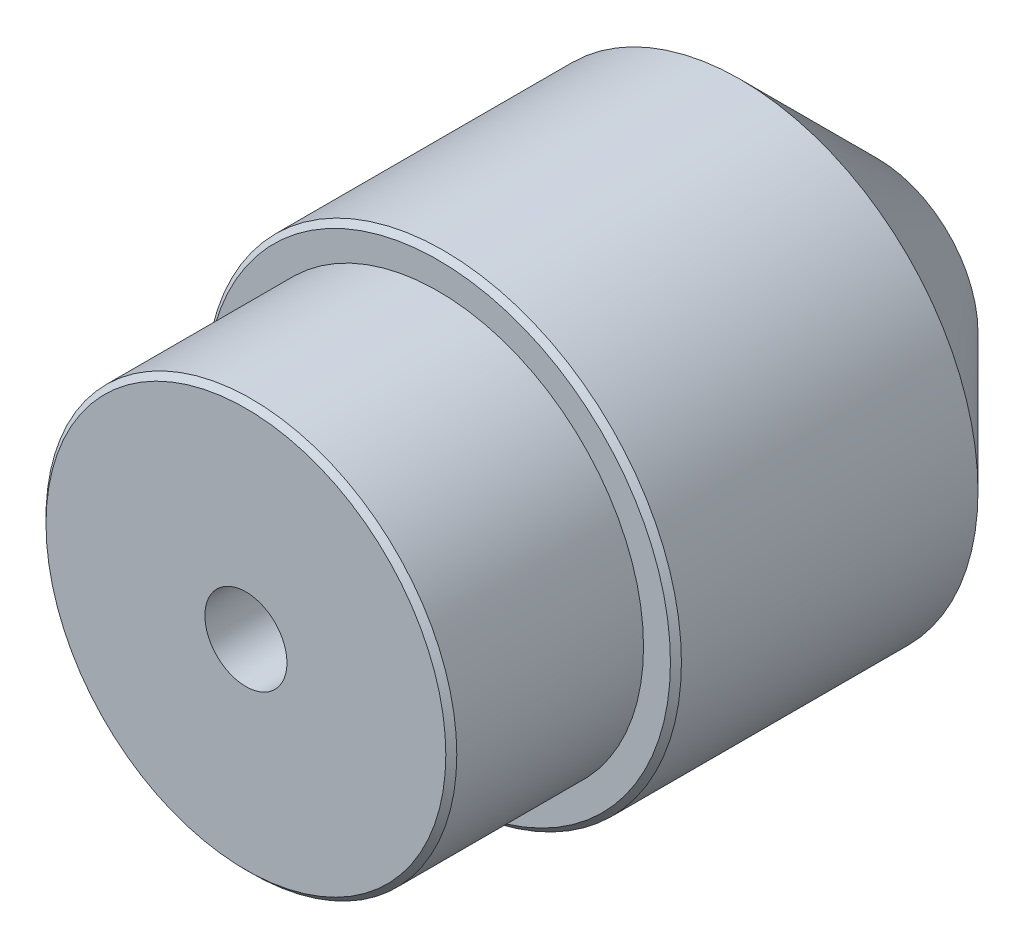
ISO-10303-21;
HEADER;
FILE_DESCRIPTION(('STEP AP214'),'2;1');
FILE_NAME('part.step','',(''),(''),'','','');
FILE_SCHEMA(('AUTOMOTIVE_DESIGN { 1 0 10303 214 1 1 1 1 }'));
ENDSEC;
DATA;
#1=APPLICATION_CONTEXT('core data for automotive mechanical design processes');
#2=APPLICATION_PROTOCOL_DEFINITION('international standard','automotive_design',2000,#1);
#3=PRODUCT_CONTEXT('',#1,'mechanical');
#4=PRODUCT('Part','Part','',(#3));
#5=PRODUCT_RELATED_PRODUCT_CATEGORY('part','',(#4));
#6=PRODUCT_DEFINITION_FORMATION('','',#4);
#7=PRODUCT_DEFINITION_CONTEXT('part definition',#1,'design');
#8=PRODUCT_DEFINITION('design','',#6,#7);
#9=PRODUCT_DEFINITION_SHAPE('','',#8);
#10=(LENGTH_UNIT() NAMED_UNIT(*) SI_UNIT(.MILLI.,.METRE.));
#11=(NAMED_UNIT(*) PLANE_ANGLE_UNIT() SI_UNIT($,.RADIAN.));
#12=(NAMED_UNIT(*) SI_UNIT($,.STERADIAN.) SOLID_ANGLE_UNIT());
#13=UNCERTAINTY_MEASURE_WITH_UNIT(LENGTH_MEASURE(1.E-05),#10,'distance_accuracy_value','');
#14=(GEOMETRIC_REPRESENTATION_CONTEXT(3) GLOBAL_UNCERTAINTY_ASSIGNED_CONTEXT((#13)) GLOBAL_UNIT_ASSIGNED_CONTEXT((#10,
#11,#12)) REPRESENTATION_CONTEXT('',''));
#15=CARTESIAN_POINT('',(0.,0.,0.));
#16=DIRECTION('',(0.,0.,1.));
#17=DIRECTION('',(1.,0.,0.));
#18=AXIS2_PLACEMENT_3D('',#15,#16,#17);
#19=CARTESIAN_POINT('',(0.,0.,20.32));
#20=DIRECTION('',(0.,0.,1.));
#21=DIRECTION('',(1.,0.,0.));
#22=AXIS2_PLACEMENT_3D('',#19,#20,#21);
#23=PLANE('',#22);
#24=CARTESIAN_POINT('',(0.,0.,20.32));
#25=DIRECTION('',(0.,0.,1.));
#26=DIRECTION('',(1.,0.,0.));
#27=AXIS2_PLACEMENT_3D('',#24,#25,#26);
#28=CIRCLE('',#27,10.7442);
#29=CARTESIAN_POINT('',(10.7442,0.,20.32));
#30=VERTEX_POINT('',#29);
#31=EDGE_CURVE('E46',#30,#30,#28,.T.);
#32=ORIENTED_EDGE('',*,*,#31,.T.);
#33=EDGE_LOOP('',(#32));
#34=FACE_BOUND('',#33,.T.);
#35=CARTESIAN_POINT('',(0.,0.,20.32));
#36=DIRECTION('',(0.,0.,1.));
#37=DIRECTION('',(1.,0.,0.));
#38=AXIS2_PLACEMENT_3D('',#35,#36,#37);
#39=CIRCLE('',#38,9.4996);
#40=CARTESIAN_POINT('',(9.4996,0.,20.32));
#41=VERTEX_POINT('',#40);
#42=EDGE_CURVE('E57',#41,#41,#39,.T.);
#43=ORIENTED_EDGE('',*,*,#42,.F.);
#44=EDGE_LOOP('',(#43));
#45=FACE_BOUND('',#44,.T.);
#46=ADVANCED_FACE('F31',(#34,#45),#23,.T.);
#47=CARTESIAN_POINT('',(0.,0.,20.32));
#48=DIRECTION('',(0.,0.,-1.));
#49=DIRECTION('',(-1.,0.,0.));
#50=AXIS2_PLACEMENT_3D('',#47,#48,#49);
#51=CYLINDRICAL_SURFACE('',#50,10.9982);
#52=CARTESIAN_POINT('',(0.,0.,20.066));
#53=DIRECTION('',(0.,0.,1.));
#54=DIRECTION('',(1.,0.,0.));
#55=AXIS2_PLACEMENT_3D('',#52,#53,#54);
#56=CIRCLE('',#55,10.9982);
#57=CARTESIAN_POINT('',(10.9982,0.,20.066));
#58=VERTEX_POINT('',#57);
#59=EDGE_CURVE('E42',#58,#58,#56,.F.);
#60=ORIENTED_EDGE('',*,*,#59,.T.);
#61=EDGE_LOOP('',(#60));
#62=FACE_BOUND('',#61,.T.);
#63=CARTESIAN_POINT('',(0.,0.,6.35000000000001));
#64=DIRECTION('',(0.,0.,1.));
#65=DIRECTION('',(1.,0.,0.));
#66=AXIS2_PLACEMENT_3D('',#63,#64,#65);
#67=CIRCLE('',#66,10.9982);
#68=CARTESIAN_POINT('',(10.9982,0.,6.35000000000001));
#69=VERTEX_POINT('',#68);
#70=EDGE_CURVE('E54',#69,#69,#67,.T.);
#71=ORIENTED_EDGE('',*,*,#70,.T.);
#72=EDGE_LOOP('',(#71));
#73=FACE_BOUND('',#72,.T.);
#74=CARTESIAN_POINT('',(-10.9982,0.,7.62635));
#75=CARTESIAN_POINT('',(-10.9981981522027,0.105805169699775,7.62635419118731));
#76=CARTESIAN_POINT('',(-10.9966573299572,0.211666676377545,7.63522411230453));
#77=CARTESIAN_POINT('',(-10.9906590947304,0.420416744316915,7.67045246854653));
#78=CARTESIAN_POINT('',(-10.9861990603541,0.523302546664586,7.69682662242512));
#79=CARTESIAN_POINT('',(-10.9748622852022,0.723051150412462,7.76624017992813));
#80=CARTESIAN_POINT('',(-10.9679875786801,0.819918941127061,7.80926555873592));
#81=CARTESIAN_POINT('',(-10.9525759242116,1.0050491882992,7.91072263706737));
#82=CARTESIAN_POINT('',(-10.9440391509983,1.0933125478777,7.96915271732388));
#83=CARTESIAN_POINT('',(-10.9261509827298,1.25964245652852,8.10039581415953));
#84=CARTESIAN_POINT('',(-10.9167928453608,1.33760825695068,8.17333560829417));
#85=CARTESIAN_POINT('',(-10.8983678395601,1.48025924536532,8.33125479214989));
#86=CARTESIAN_POINT('',(-10.8893009902165,1.54494356451329,8.41623496891143));
#87=CARTESIAN_POINT('',(-10.8724198005586,1.6596034386086,8.59652025629677));
#88=CARTESIAN_POINT('',(-10.8646141679122,1.70947857462869,8.69189011914977));
#89=CARTESIAN_POINT('',(-10.8512331660203,1.79246196515001,8.88981163247926));
#90=CARTESIAN_POINT('',(-10.8456576348104,1.82557143732857,8.99236276076994));
#91=CARTESIAN_POINT('',(-10.8374354569708,1.87376456677414,9.20066492804943));
#92=CARTESIAN_POINT('',(-10.8347604863597,1.88902266098775,9.3063744695933));
#93=CARTESIAN_POINT('',(-10.8325567036275,1.90162092301735,9.51888454772653));
#94=CARTESIAN_POINT('',(-10.8330276526229,1.89896245131767,9.62568500086322));
#95=CARTESIAN_POINT('',(-10.8370366568575,1.87594495377548,9.8360949488731));
#96=CARTESIAN_POINT('',(-10.8405406429477,1.85578253684005,9.93972669549237));
#97=CARTESIAN_POINT('',(-10.8501675314227,1.79863833012198,10.1421140951366));
#98=CARTESIAN_POINT('',(-10.8562905295773,1.76165592527637,10.2408695697027));
#99=CARTESIAN_POINT('',(-10.8705020116869,1.67172415481341,10.431286037754));
#100=CARTESIAN_POINT('',(-10.8786004276022,1.61869376874274,10.5229079943307));
#101=CARTESIAN_POINT('',(-10.8958434562452,1.49822883443675,10.6960274072288));
#102=CARTESIAN_POINT('',(-10.9049881593818,1.43079304100222,10.7775239873519));
#103=CARTESIAN_POINT('',(-10.9234427448171,1.2823633962788,10.9292167556477));
#104=CARTESIAN_POINT('',(-10.9327532053692,1.20120099766036,10.999248056485));
#105=CARTESIAN_POINT('',(-10.9503778984883,1.02819041146371,11.1247235170541));
#106=CARTESIAN_POINT('',(-10.9586921237378,0.936342145406323,11.1801675696446));
#107=CARTESIAN_POINT('',(-10.9734006631464,0.744407370237959,11.2749122184387));
#108=CARTESIAN_POINT('',(-10.9797931591835,0.644313173087853,11.3141975399402));
#109=CARTESIAN_POINT('',(-10.9899235510794,0.438812227991438,11.3753527971164));
#110=CARTESIAN_POINT('',(-10.9936616854047,0.333405958190309,11.3972242972608));
#111=CARTESIAN_POINT('',(-10.9980299124006,0.121693421344151,11.4227058942165));
#112=CARTESIAN_POINT('',(-10.9986985071316,0.0154151509765399,11.4265422257411));
#113=CARTESIAN_POINT('',(-10.9969580240364,-0.196265152216859,11.4164487533041));
#114=CARTESIAN_POINT('',(-10.9945490735758,-0.301667221122969,11.4025196845722));
#115=CARTESIAN_POINT('',(-10.9869480445593,-0.50789918000874,11.3574789660847));
#116=CARTESIAN_POINT('',(-10.981774224469,-0.608754411344912,11.3264800009839));
#117=CARTESIAN_POINT('',(-10.9692212006634,-0.803836403059839,11.2483000604198));
#118=CARTESIAN_POINT('',(-10.9618418657218,-0.898062768614464,11.2011181220587));
#119=CARTESIAN_POINT('',(-10.9456006544914,-1.07819027625845,11.0913982115847));
#120=CARTESIAN_POINT('',(-10.9367254668053,-1.16400462837157,11.0287197651377));
#121=CARTESIAN_POINT('',(-10.9185154356284,-1.32397810118442,10.8899784113338));
#122=CARTESIAN_POINT('',(-10.9091805561973,-1.3981363086614,10.8139144562523));
#123=CARTESIAN_POINT('',(-10.8909778456659,-1.53353684175208,10.6495438905259));
#124=CARTESIAN_POINT('',(-10.8821163854313,-1.59462587659879,10.5611101879177));
#125=CARTESIAN_POINT('',(-10.8659852864205,-1.7010814285635,10.375103121543));
#126=CARTESIAN_POINT('',(-10.8587155945956,-1.74644846967563,10.2775300625174));
#127=CARTESIAN_POINT('',(-10.8466395475728,-1.81994621607004,10.076431771547));
#128=CARTESIAN_POINT('',(-10.8418225409144,-1.84815155676469,9.97293448628562));
#129=CARTESIAN_POINT('',(-10.835171176123,-1.88675893490306,9.76258058260205));
#130=CARTESIAN_POINT('',(-10.8333365378178,-1.89716264468804,9.65572428069706));
#131=CARTESIAN_POINT('',(-10.832870305882,-1.89982221280537,9.44321755037282));
#132=CARTESIAN_POINT('',(-10.8341961030065,-1.89231948552592,9.33757015976555));
#133=CARTESIAN_POINT('',(-10.8398076728573,-1.85990296358853,9.12906547522124));
#134=CARTESIAN_POINT('',(-10.8440934339185,-1.83498923754644,9.02620817029028));
#135=CARTESIAN_POINT('',(-10.8551253546543,-1.76855304089431,8.82630681792631));
#136=CARTESIAN_POINT('',(-10.8618682148489,-1.72705283599704,8.72925517695578));
#137=CARTESIAN_POINT('',(-10.8770575206373,-1.62864691817877,8.54345293648553));
#138=CARTESIAN_POINT('',(-10.8855040607473,-1.57174035048881,8.45470279793377));
#139=CARTESIAN_POINT('',(-10.9032833331209,-1.4432815796682,8.28680595562742));
#140=CARTESIAN_POINT('',(-10.9126259718329,-1.37155227727316,8.20779577993173));
#141=CARTESIAN_POINT('',(-10.9310671230827,-1.21585664466577,8.06285135278722));
#142=CARTESIAN_POINT('',(-10.9401655788911,-1.13188749950346,7.9969201175233));
#143=CARTESIAN_POINT('',(-10.957172232591,-0.95334871378384,7.87955220916349));
#144=CARTESIAN_POINT('',(-10.9650710374569,-0.85870461468337,7.82822742056621));
#145=CARTESIAN_POINT('',(-10.9786970083391,-0.662037635621355,7.74228550052501));
#146=CARTESIAN_POINT('',(-10.9844263024651,-0.560022104038684,7.70765198718156));
#147=CARTESIAN_POINT('',(-10.9918398510686,-0.381362912160016,7.66346074938477));
#148=CARTESIAN_POINT('',(-10.9942119628291,-0.305790667160204,7.64956691011833));
#149=CARTESIAN_POINT('',(-10.9973926924862,-0.153488816913143,7.63101010412905));
#150=CARTESIAN_POINT('',(-10.9982013405347,-0.07675923401428,7.62634695938934));
#151=CARTESIAN_POINT('',(-10.9982,0.,7.62635));
#152=B_SPLINE_CURVE_WITH_KNOTS('',3,(#74,#75,#76,#77,#78,#79,#80,#81,#82,#83,#84,#85,#86,#87,
#88,#89,#90,#91,#92,#93,#94,#95,#96,#97,#98,#99,#100,#101,#102,#103,#104,#105,#106,#107,#108,
#109,#110,#111,#112,#113,#114,#115,#116,#117,#118,#119,#120,#121,#122,#123,#124,#125,#126,#127,
#128,#129,#130,#131,#132,#133,#134,#135,#136,#137,#138,#139,#140,#141,#142,#143,#144,#145,#146,
#147,#148,#149,#150,#151),.UNSPECIFIED.,.T.,.F.,(4,2,2,2,2,2,2,2,2,2,2,2,2,2,2,2,2,2,2,2,2,2,2,
2,2,2,2,2,2,2,2,2,2,2,2,2,2,2,4),(0.,0.31713489522746,0.634554962760638,0.951708256916438,
1.26882822674582,1.58885140688077,1.90889551554415,2.23106267822915,2.55320643880246,
2.87217532118704,3.19111998312225,3.50652785763044,3.82194726670695,4.13898646109478,
4.45605307135564,4.77734081510208,5.09863091859963,5.42022404057008,5.74178826713134,
6.05930780462554,6.37681420184572,6.692249321927,7.00770321386824,7.32612883958857,
7.64457940054628,7.96658197809409,8.28857382267205,8.60915514026151,8.92970633977867,
9.24596033656176,9.56221308701077,9.87804271762409,10.1938898745481,10.513754946496,
10.8336936982264,11.1560209682863,11.4780312379429,11.7081097982125,11.9381839213005),.UNSPECIFIED.);
#153=CARTESIAN_POINT('',(-10.9982,0.,7.62635));
#154=VERTEX_POINT('',#153);
#155=EDGE_CURVE('E65',#154,#154,#152,.T.);
#156=ORIENTED_EDGE('',*,*,#155,.T.);
#157=EDGE_LOOP('',(#156));
#158=FACE_BOUND('',#157,.T.);
#159=CARTESIAN_POINT('',(0.,-10.9982,11.42365));
#160=CARTESIAN_POINT('',(0.105805169699774,-10.9981981522027,11.4236458088127));
#161=CARTESIAN_POINT('',(0.211666676377545,-10.9966573299572,11.4147758876955));
#162=CARTESIAN_POINT('',(0.420416744316915,-10.9906590947304,11.3795475314535));
#163=CARTESIAN_POINT('',(0.523302546664586,-10.9861990603541,11.3531733775749));
#164=CARTESIAN_POINT('',(0.723051150412462,-10.9748622852022,11.2837598200719));
#165=CARTESIAN_POINT('',(0.819918941127061,-10.9679875786801,11.2407344412641));
#166=CARTESIAN_POINT('',(1.0050491882992,-10.9525759242116,11.1392773629326));
#167=CARTESIAN_POINT('',(1.0933125478777,-10.9440391509983,11.0808472826761));
#168=CARTESIAN_POINT('',(1.25964245652852,-10.9261509827298,10.9496041858405));
#169=CARTESIAN_POINT('',(1.33760825695068,-10.9167928453608,10.8766643917058));
#170=CARTESIAN_POINT('',(1.48025924536532,-10.8983678395601,10.7187452078501));
#171=CARTESIAN_POINT('',(1.54494356451329,-10.8893009902165,10.6337650310886));
#172=CARTESIAN_POINT('',(1.65960343860861,-10.8724198005586,10.4534797437032));
#173=CARTESIAN_POINT('',(1.70947857462869,-10.8646141679122,10.3581098808502));
#174=CARTESIAN_POINT('',(1.79246196515001,-10.8512331660203,10.1601883675207));
#175=CARTESIAN_POINT('',(1.82557143732857,-10.8456576348104,10.0576372392301));
#176=CARTESIAN_POINT('',(1.87376456677414,-10.8374354569708,9.84933507195057));
#177=CARTESIAN_POINT('',(1.88902266098775,-10.8347604863597,9.7436255304067));
#178=CARTESIAN_POINT('',(1.90162092301735,-10.8325567036275,9.53111545227347));
#179=CARTESIAN_POINT('',(1.89896245131767,-10.8330276526229,9.42431499913678));
#180=CARTESIAN_POINT('',(1.87594495377548,-10.8370366568575,9.2139050511269));
#181=CARTESIAN_POINT('',(1.85578253684005,-10.8405406429477,9.11027330450763));
#182=CARTESIAN_POINT('',(1.79863833012198,-10.8501675314227,8.90788590486339));
#183=CARTESIAN_POINT('',(1.76165592527637,-10.8562905295773,8.80913043029733));
#184=CARTESIAN_POINT('',(1.67172415481341,-10.8705020116869,8.61871396224603));
#185=CARTESIAN_POINT('',(1.61869376874274,-10.8786004276022,8.52709200566934));
#186=CARTESIAN_POINT('',(1.49822883443675,-10.8958434562452,8.35397259277116));
#187=CARTESIAN_POINT('',(1.43079304100222,-10.9049881593818,8.27247601264806));
#188=CARTESIAN_POINT('',(1.2823633962788,-10.9234427448171,8.12078324435231));
#189=CARTESIAN_POINT('',(1.20120099766036,-10.9327532053692,8.05075194351504));
#190=CARTESIAN_POINT('',(1.02819041146371,-10.9503778984883,7.92527648294586));
#191=CARTESIAN_POINT('',(0.936342145406323,-10.9586921237378,7.86983243035541));
#192=CARTESIAN_POINT('',(0.744407370237959,-10.9734006631464,7.77508778156132));
#193=CARTESIAN_POINT('',(0.644313173087853,-10.9797931591835,7.73580246005982));
#194=CARTESIAN_POINT('',(0.438812227991438,-10.9899235510794,7.67464720288361));
#195=CARTESIAN_POINT('',(0.333405958190309,-10.9936616854047,7.65277570273917));
#196=CARTESIAN_POINT('',(0.121693421344151,-10.9980299124006,7.62729410578349));
#197=CARTESIAN_POINT('',(0.0154151509765401,-10.9986985071316,7.62345777425888));
#198=CARTESIAN_POINT('',(-0.196265152216859,-10.9969580240364,7.63355124669592));
#199=CARTESIAN_POINT('',(-0.301667221122969,-10.9945490735758,7.64748031542784));
#200=CARTESIAN_POINT('',(-0.50789918000874,-10.9869480445593,7.69252103391525));
#201=CARTESIAN_POINT('',(-0.608754411344912,-10.981774224469,7.72351999901613));
#202=CARTESIAN_POINT('',(-0.803836403059839,-10.9692212006634,7.80169993958025));
#203=CARTESIAN_POINT('',(-0.898062768614464,-10.9618418657218,7.84888187794134));
#204=CARTESIAN_POINT('',(-1.07819027625845,-10.9456006544914,7.95860178841535));
#205=CARTESIAN_POINT('',(-1.16400462837157,-10.9367254668053,8.02128023486229));
#206=CARTESIAN_POINT('',(-1.32397810118442,-10.9185154356284,8.16002158866623));
#207=CARTESIAN_POINT('',(-1.3981363086614,-10.9091805561973,8.2360855437477));
#208=CARTESIAN_POINT('',(-1.53353684175208,-10.8909778456659,8.4004561094741));
#209=CARTESIAN_POINT('',(-1.59462587659879,-10.8821163854313,8.48888981208231));
#210=CARTESIAN_POINT('',(-1.7010814285635,-10.8659852864205,8.67489687845701));
#211=CARTESIAN_POINT('',(-1.74644846967562,-10.8587155945956,8.77246993748263));
#212=CARTESIAN_POINT('',(-1.81994621607004,-10.8466395475728,8.97356822845297));
#213=CARTESIAN_POINT('',(-1.84815155676469,-10.8418225409144,9.07706551371438));
#214=CARTESIAN_POINT('',(-1.88675893490306,-10.835171176123,9.28741941739795));
#215=CARTESIAN_POINT('',(-1.89716264468804,-10.8333365378178,9.39427571930294));
#216=CARTESIAN_POINT('',(-1.89982221280537,-10.832870305882,9.60678244962718));
#217=CARTESIAN_POINT('',(-1.89231948552592,-10.8341961030065,9.71242984023445));
#218=CARTESIAN_POINT('',(-1.85990296358853,-10.8398076728573,9.92093452477876));
#219=CARTESIAN_POINT('',(-1.83498923754644,-10.8440934339185,10.0237918297097));
#220=CARTESIAN_POINT('',(-1.76855304089431,-10.8551253546543,10.2236931820737));
#221=CARTESIAN_POINT('',(-1.72705283599704,-10.8618682148489,10.3207448230442));
#222=CARTESIAN_POINT('',(-1.62864691817877,-10.8770575206373,10.5065470635145));
#223=CARTESIAN_POINT('',(-1.57174035048881,-10.8855040607473,10.5952972020662));
#224=CARTESIAN_POINT('',(-1.4432815796682,-10.9032833331209,10.7631940443726));
#225=CARTESIAN_POINT('',(-1.37155227727316,-10.9126259718329,10.8422042200683));
#226=CARTESIAN_POINT('',(-1.21585664466577,-10.9310671230827,10.9871486472128));
#227=CARTESIAN_POINT('',(-1.13188749950346,-10.9401655788911,11.0530798824767));
#228=CARTESIAN_POINT('',(-0.953348713783841,-10.957172232591,11.1704477908365));
#229=CARTESIAN_POINT('',(-0.85870461468337,-10.9650710374569,11.2217725794338));
#230=CARTESIAN_POINT('',(-0.662037635621355,-10.9786970083391,11.307714499475));
#231=CARTESIAN_POINT('',(-0.560022104038684,-10.9844263024651,11.3423480128184));
#232=CARTESIAN_POINT('',(-0.381362912160016,-10.9918398510686,11.3865392506152));
#233=CARTESIAN_POINT('',(-0.305790667160204,-10.9942119628291,11.4004330898817));
#234=CARTESIAN_POINT('',(-0.153488816913143,-10.9973926924862,11.418989895871));
#235=CARTESIAN_POINT('',(-0.07675923401428,-10.9982013405347,11.4236530406107));
#236=CARTESIAN_POINT('',(0.,-10.9982,11.42365));
#237=B_SPLINE_CURVE_WITH_KNOTS('',3,(#159,#160,#161,#162,#163,#164,#165,#166,#167,#168,#169,
#170,#171,#172,#173,#174,#175,#176,#177,#178,#179,#180,#181,#182,#183,#184,#185,#186,#187,#188,
#189,#190,#191,#192,#193,#194,#195,#196,#197,#198,#199,#200,#201,#202,#203,#204,#205,#206,#207,
#208,#209,#210,#211,#212,#213,#214,#215,#216,#217,#218,#219,#220,#221,#222,#223,#224,#225,#226,
#227,#228,#229,#230,#231,#232,#233,#234,#235,#236),.UNSPECIFIED.,.T.,.F.,(4,2,2,2,2,2,2,2,2,2,2,
2,2,2,2,2,2,2,2,2,2,2,2,2,2,2,2,2,2,2,2,2,2,2,2,2,2,2,4),(0.,0.31713489522746,0.634554962760638,
0.951708256916437,1.26882822674582,1.58885140688077,1.90889551554415,2.23106267822915,
2.55320643880246,2.87217532118704,3.19111998312225,3.50652785763044,3.82194726670695,
4.13898646109478,4.45605307135564,4.77734081510208,5.09863091859963,5.42022404057007,
5.74178826713134,6.05930780462554,6.37681420184572,6.692249321927,7.00770321386824,
7.32612883958857,7.64457940054628,7.96658197809409,8.28857382267205,8.60915514026151,
8.92970633977867,9.24596033656176,9.56221308701077,9.87804271762408,10.1938898745481,
10.513754946496,10.8336936982264,11.1560209682863,11.4780312379429,11.7081097982125,
11.9381839213005),.UNSPECIFIED.);
#238=CARTESIAN_POINT('',(0.,-10.9982,11.42365));
#239=VERTEX_POINT('',#238);
#240=EDGE_CURVE('E89',#239,#239,#237,.T.);
#241=ORIENTED_EDGE('',*,*,#240,.T.);
#242=EDGE_LOOP('',(#241));
#243=FACE_BOUND('',#242,.T.);
#244=ADVANCED_FACE('F93',(#62,#73,#158,#243),#51,.T.);
#245=CARTESIAN_POINT('',(0.,0.,0.));
#246=DIRECTION('',(0.,0.,1.));
#247=DIRECTION('',(1.,0.,0.));
#248=AXIS2_PLACEMENT_3D('',#245,#246,#247);
#249=PLANE('',#248);
#250=CARTESIAN_POINT('',(0.,0.,0.));
#251=DIRECTION('',(0.,0.,1.));
#252=DIRECTION('',(1.,0.,0.));
#253=AXIS2_PLACEMENT_3D('',#250,#251,#252);
#254=CIRCLE('',#253,4.64819999999997);
#255=CARTESIAN_POINT('',(4.64819999999997,0.,0.));
#256=VERTEX_POINT('',#255);
#257=EDGE_CURVE('E51',#256,#256,#254,.F.);
#258=ORIENTED_EDGE('',*,*,#257,.T.);
#259=EDGE_LOOP('',(#258));
#260=FACE_BOUND('',#259,.T.);
#261=CARTESIAN_POINT('',(0.,0.,0.));
#262=DIRECTION('',(0.,0.,-1.));
#263=DIRECTION('',(-1.,0.,0.));
#264=AXIS2_PLACEMENT_3D('',#261,#262,#263);
#265=CIRCLE('',#264,3.02259999999999);
#266=CARTESIAN_POINT('',(-3.02259999999999,0.,0.));
#267=VERTEX_POINT('',#266);
#268=EDGE_CURVE('E140',#267,#267,#265,.T.);
#269=ORIENTED_EDGE('',*,*,#268,.F.);
#270=EDGE_LOOP('',(#269));
#271=FACE_BOUND('',#270,.T.);
#272=ADVANCED_FACE('F98',(#260,#271),#249,.F.);
#273=CARTESIAN_POINT('',(0.,0.,29.21));
#274=DIRECTION('',(0.,0.,-1.));
#275=DIRECTION('',(-1.,0.,0.));
#276=AXIS2_PLACEMENT_3D('',#273,#274,#275);
#277=CYLINDRICAL_SURFACE('',#276,9.4996);
#278=CARTESIAN_POINT('',(0.,0.,28.956));
#279=DIRECTION('',(0.,0.,1.));
#280=DIRECTION('',(1.,0.,0.));
#281=AXIS2_PLACEMENT_3D('',#278,#279,#280);
#282=CIRCLE('',#281,9.4996);
#283=CARTESIAN_POINT('',(9.4996,0.,28.956));
#284=VERTEX_POINT('',#283);
#285=EDGE_CURVE('E10',#284,#284,#282,.F.);
#286=ORIENTED_EDGE('',*,*,#285,.T.);
#287=EDGE_LOOP('',(#286));
#288=FACE_BOUND('',#287,.T.);
#289=ORIENTED_EDGE('',*,*,#42,.T.);
#290=EDGE_LOOP('',(#289));
#291=FACE_BOUND('',#290,.T.);
#292=ADVANCED_FACE('F119',(#288,#291),#277,.T.);
#293=CARTESIAN_POINT('',(0.,0.,29.21));
#294=DIRECTION('',(0.,0.,1.));
#295=DIRECTION('',(1.,0.,0.));
#296=AXIS2_PLACEMENT_3D('',#293,#294,#295);
#297=PLANE('',#296);
#298=CARTESIAN_POINT('',(0.,0.,29.21));
#299=DIRECTION('',(0.,0.,1.));
#300=DIRECTION('',(1.,0.,0.));
#301=AXIS2_PLACEMENT_3D('',#298,#299,#300);
#302=CIRCLE('',#301,9.2456);
#303=CARTESIAN_POINT('',(9.2456,0.,29.21));
#304=VERTEX_POINT('',#303);
#305=EDGE_CURVE('E38',#304,#304,#302,.T.);
#306=ORIENTED_EDGE('',*,*,#305,.T.);
#307=EDGE_LOOP('',(#306));
#308=FACE_BOUND('',#307,.T.);
#309=CARTESIAN_POINT('',(0.,0.,29.21));
#310=DIRECTION('',(0.,0.,1.));
#311=DIRECTION('',(1.,0.,0.));
#312=AXIS2_PLACEMENT_3D('',#309,#310,#311);
#313=CIRCLE('',#312,1.89865);
#314=CARTESIAN_POINT('',(1.89865,0.,29.21));
#315=VERTEX_POINT('',#314);
#316=EDGE_CURVE('E146',#315,#315,#313,.T.);
#317=ORIENTED_EDGE('',*,*,#316,.F.);
#318=EDGE_LOOP('',(#317));
#319=FACE_BOUND('',#318,.T.);
#320=ADVANCED_FACE('F122',(#308,#319),#297,.T.);
#321=CARTESIAN_POINT('',(0.,0.,19.05));
#322=DIRECTION('',(0.,0.,-1.));
#323=DIRECTION('',(-1.,0.,0.));
#324=AXIS2_PLACEMENT_3D('',#321,#322,#323);
#325=CONICAL_SURFACE('',#324,3.02259999999999,1.02974425867665);
#326=CARTESIAN_POINT('',(0.,0.,19.725337292756));
#327=DIRECTION('',(0.,0.,-1.));
#328=DIRECTION('',(-1.,0.,0.));
#329=AXIS2_PLACEMENT_3D('',#326,#327,#328);
#330=CIRCLE('',#329,1.89865);
#331=CARTESIAN_POINT('',(-1.89865,0.,19.725337292756));
#332=VERTEX_POINT('',#331);
#333=EDGE_CURVE('E135',#332,#332,#330,.F.);
#334=ORIENTED_EDGE('',*,*,#333,.T.);
#335=EDGE_LOOP('',(#334));
#336=FACE_BOUND('',#335,.T.);
#337=CARTESIAN_POINT('',(0.,0.,19.05));
#338=DIRECTION('',(0.,0.,-1.));
#339=DIRECTION('',(-1.,0.,0.));
#340=AXIS2_PLACEMENT_3D('',#337,#338,#339);
#341=CIRCLE('',#340,3.02259999999999);
#342=CARTESIAN_POINT('',(-3.02259999999999,0.,19.05));
#343=VERTEX_POINT('',#342);
#344=EDGE_CURVE('E138',#343,#343,#341,.T.);
#345=ORIENTED_EDGE('',*,*,#344,.T.);
#346=EDGE_LOOP('',(#345));
#347=FACE_BOUND('',#346,.T.);
#348=ADVANCED_FACE('F124',(#336,#347),#325,.F.);
#349=CARTESIAN_POINT('',(0.,0.,0.));
#350=DIRECTION('',(0.,0.,-1.));
#351=DIRECTION('',(-1.,0.,0.));
#352=AXIS2_PLACEMENT_3D('',#349,#350,#351);
#353=CYLINDRICAL_SURFACE('',#352,3.02259999999999);
#354=CARTESIAN_POINT('',(-3.02259999999999,0.,11.42365));
#355=CARTESIAN_POINT('',(-3.02259269615652,0.0963812552156397,11.4236420415189));
#356=CARTESIAN_POINT('',(-3.01794168894507,0.192876430346741,11.4162610099562));
#357=CARTESIAN_POINT('',(-2.99977609579035,0.382897701977146,11.3871336617559));
#358=CARTESIAN_POINT('',(-2.98624526399484,0.476418026480892,11.3653610147854));
#359=CARTESIAN_POINT('',(-2.95168023540514,0.65737383433043,11.3087255611361));
#360=CARTESIAN_POINT('',(-2.93068317373823,0.744836917592506,11.2739274952466));
#361=CARTESIAN_POINT('',(-2.88292929889071,0.912375517847534,11.1926693834907));
#362=CARTESIAN_POINT('',(-2.85617302952691,0.992451731331157,11.1462104386415));
#363=CARTESIAN_POINT('',(-2.79656759469633,1.15021215197416,11.0388387676593));
#364=CARTESIAN_POINT('',(-2.76340175463649,1.22718843578588,10.9770652006322));
#365=CARTESIAN_POINT('',(-2.69527138405427,1.37037400763607,10.8428006224334));
#366=CARTESIAN_POINT('',(-2.66030446528578,1.43656848852884,10.7702951289809));
#367=CARTESIAN_POINT('',(-2.58677220843686,1.56555025319511,10.6049905705945));
#368=CARTESIAN_POINT('',(-2.54837070746583,1.62662645131565,10.510772104973));
#369=CARTESIAN_POINT('',(-2.47803108819241,1.73190417638356,10.3111645387726));
#370=CARTESIAN_POINT('',(-2.44608205792667,1.77613430638597,10.205794764428));
#371=CARTESIAN_POINT('',(-2.40104028999716,1.83633994990681,10.0148565190489));
#372=CARTESIAN_POINT('',(-2.38520131846803,1.85667963282389,9.93131641542008));
#373=CARTESIAN_POINT('',(-2.36218732518078,1.88587885993098,9.76113457891678));
#374=CARTESIAN_POINT('',(-2.354999874378,1.89475487452654,9.67449748011085));
#375=CARTESIAN_POINT('',(-2.35037310138543,1.90049323594066,9.5003188556631));
#376=CARTESIAN_POINT('',(-2.35296025658582,1.89732295168903,9.41277551497726));
#377=CARTESIAN_POINT('',(-2.36752455960891,1.87911268583946,9.23970570086978));
#378=CARTESIAN_POINT('',(-2.3795092842415,1.86406312648612,9.15418091224976));
#379=CARTESIAN_POINT('',(-2.41074654882282,1.82346899059586,8.98939868707535));
#380=CARTESIAN_POINT('',(-2.42981586117394,1.79818767579282,8.91003957862818));
#381=CARTESIAN_POINT('',(-2.4731251299963,1.7381398952954,8.75653185202734));
#382=CARTESIAN_POINT('',(-2.49736690794845,1.70337008702683,8.68238508165609));
#383=CARTESIAN_POINT('',(-2.55379769233044,1.61781260322063,8.52656432912636));
#384=CARTESIAN_POINT('',(-2.58662369879014,1.56524177830016,8.44610069219661));
#385=CARTESIAN_POINT('',(-2.65355121775274,1.44889324102442,8.2942505471039));
#386=CARTESIAN_POINT('',(-2.6876540214767,1.385103928534,8.22287356771109));
#387=CARTESIAN_POINT('',(-2.76003475425026,1.23544825890872,8.07895403065423));
#388=CARTESIAN_POINT('',(-2.79804827948731,1.14767306918587,8.00824055346323));
#389=CARTESIAN_POINT('',(-2.86809283701309,0.959288703104668,7.88261408810038));
#390=CARTESIAN_POINT('',(-2.90012608582625,0.858684305114995,7.82769524172462));
#391=CARTESIAN_POINT('',(-2.95314134349874,0.652519717827756,7.73865899930907));
#392=CARTESIAN_POINT('',(-2.97461648017451,0.547499484387667,7.70359849273137));
#393=CARTESIAN_POINT('',(-3.0063528608698,0.331391264557748,7.65221168134588));
#394=CARTESIAN_POINT('',(-3.01663030927924,0.220312291156045,7.63585830337606));
#395=CARTESIAN_POINT('',(-3.0240721013989,0.0134132623025168,7.62400528461562));
#396=CARTESIAN_POINT('',(-3.02297175334735,-0.0821971009532707,7.62574619391712));
#397=CARTESIAN_POINT('',(-3.01186912156237,-0.271552324886177,7.64346703149052));
#398=CARTESIAN_POINT('',(-3.00186750971637,-0.365297325819034,7.65944588505044));
#399=CARTESIAN_POINT('',(-2.97449092620119,-0.544425664027118,7.70383398668726));
#400=CARTESIAN_POINT('',(-2.95743638730436,-0.629994349783774,7.73170452738456));
#401=CARTESIAN_POINT('',(-2.91737639850926,-0.795143459143157,7.79856969951965));
#402=CARTESIAN_POINT('',(-2.89436997071898,-0.874722895939438,7.83756615904803));
#403=CARTESIAN_POINT('',(-2.84148959294261,-1.03431422038709,7.92988255006132));
#404=CARTESIAN_POINT('',(-2.81115805362274,-1.11356736248053,7.98424746347307));
#405=CARTESIAN_POINT('',(-2.74755959177674,-1.26237481022518,8.10359350794824));
#406=CARTESIAN_POINT('',(-2.71428945958076,-1.33191829119639,8.16858631492061));
#407=CARTESIAN_POINT('',(-2.64240518654861,-1.46993399332961,8.31834773583611));
#408=CARTESIAN_POINT('',(-2.60372389275433,-1.53674848713591,8.40461888491672));
#409=CARTESIAN_POINT('',(-2.53007332801953,-1.65520532407197,8.5884615302729));
#410=CARTESIAN_POINT('',(-2.49510168993218,-1.70685738006533,8.68602573625742));
#411=CARTESIAN_POINT('',(-2.44023536995219,-1.78413197632444,8.86964526562597));
#412=CARTESIAN_POINT('',(-2.41871762947002,-1.81293454047723,8.95386983270583));
#413=CARTESIAN_POINT('',(-2.38378766013326,-1.85862997004283,9.12705772048393));
#414=CARTESIAN_POINT('',(-2.37036263353384,-1.87554164668412,9.21601331582261));
#415=CARTESIAN_POINT('',(-2.35361317144254,-1.89652619631619,9.39696078207851));
#416=CARTESIAN_POINT('',(-2.35034934473006,-1.90052203524938,9.48896757632689));
#417=CARTESIAN_POINT('',(-2.35468484824973,-1.89514605889647,9.67234733980393));
#418=CARTESIAN_POINT('',(-2.36228736391422,-1.88577032377943,9.76372011528092));
#419=CARTESIAN_POINT('',(-2.38597671858277,-1.85567827656934,9.93520657896273));
#420=CARTESIAN_POINT('',(-2.40128839679293,-1.83599241639014,10.0156175291903));
#421=CARTESIAN_POINT('',(-2.43802576642577,-1.78691822019534,10.1719262350789));
#422=CARTESIAN_POINT('',(-2.45945406639764,-1.75752574376834,10.247822048451));
#423=CARTESIAN_POINT('',(-2.50973885484698,-1.685089153023,10.4046834756497));
#424=CARTESIAN_POINT('',(-2.5392194623632,-1.64069359678623,10.4848211112814));
#425=CARTESIAN_POINT('',(-2.60068017413303,-1.54142437391256,10.6372822957473));
#426=CARTESIAN_POINT('',(-2.63266226628214,-1.48654232279028,10.7095995188152));
#427=CARTESIAN_POINT('',(-2.70313622097732,-1.35491520950841,10.8595153463248));
#428=CARTESIAN_POINT('',(-2.74163507406644,-1.27599338191688,10.9352188208694));
#429=CARTESIAN_POINT('',(-2.81483693526268,-1.10519579028048,11.0727239492489));
#430=CARTESIAN_POINT('',(-2.84953744315278,-1.01331158388129,11.1345164742984));
#431=CARTESIAN_POINT('',(-2.91177860871446,-0.81744783369283,11.242314908652));
#432=CARTESIAN_POINT('',(-2.93927265725111,-0.713395556502275,11.288218637579));
#433=CARTESIAN_POINT('',(-2.97243816159599,-0.551169706187002,11.3427865756462));
#434=CARTESIAN_POINT('',(-2.98214218818246,-0.496123176982466,11.3585866446579));
#435=CARTESIAN_POINT('',(-2.99858391323829,-0.384421175379172,11.3852093629912));
#436=CARTESIAN_POINT('',(-3.00532376194816,-0.327766901117219,11.3960356206142));
#437=CARTESIAN_POINT('',(-3.01447898123125,-0.225924238864893,11.4107012227001));
#438=CARTESIAN_POINT('',(-3.01751733032144,-0.180933966758163,11.4155501015813));
#439=CARTESIAN_POINT('',(-3.02157961839753,-0.0906375426504294,11.4220264594634));
#440=CARTESIAN_POINT('',(-3.02260343524517,-0.0453313716640284,11.4236537431435));
#441=CARTESIAN_POINT('',(-3.02259999999999,0.,11.42365));
#442=B_SPLINE_CURVE_WITH_KNOTS('',3,(#354,#355,#356,#357,#358,#359,#360,#361,#362,#363,#364,
#365,#366,#367,#368,#369,#370,#371,#372,#373,#374,#375,#376,#377,#378,#379,#380,#381,#382,#383,
#384,#385,#386,#387,#388,#389,#390,#391,#392,#393,#394,#395,#396,#397,#398,#399,#400,#401,#402,
#403,#404,#405,#406,#407,#408,#409,#410,#411,#412,#413,#414,#415,#416,#417,#418,#419,#420,#421,
#422,#423,#424,#425,#426,#427,#428,#429,#430,#431,#432,#433,#434,#435,#436,#437,#438,#439,#440,
#441),.UNSPECIFIED.,.T.,.F.,(4,2,2,2,2,2,2,2,2,2,2,2,2,2,2,2,2,2,2,2,2,2,2,2,2,2,2,2,2,2,2,2,2,
2,2,2,2,2,2,2,2,2,2,4),(0.,0.28896151580857,0.578453172985161,0.866524661914147,1.1545689614347,
1.46573389874182,1.77732263427631,2.13162643205556,2.48532594435195,2.74652315775549,
3.00734467751216,3.26887321483227,3.53061282715784,3.78600741113161,4.04149208104037,
4.34506829356923,4.64896027549613,5.00404381288205,5.35899547999071,5.69525538578426,
6.03102803442991,6.31644867415333,6.60184777151139,6.87549980388451,7.14919682571844,
7.45037285546049,7.75188201095149,8.09767778656983,8.44325156401876,8.71690339484735,
8.9901213320516,9.26496584751835,9.53989094927219,9.7914737080272,10.0431639197253,
10.3308604449351,10.6187879680452,10.9650106370356,11.311459849778,11.6600973840866,
11.8340970838558,12.0079703536917,12.1438705112253,12.2797789079401),.UNSPECIFIED.);
#443=CARTESIAN_POINT('',(-3.02259999999999,0.,11.42365));
#444=VERTEX_POINT('',#443);
#445=EDGE_CURVE('E58',#444,#444,#442,.T.);
#446=ORIENTED_EDGE('',*,*,#445,.T.);
#447=EDGE_LOOP('',(#446));
#448=FACE_BOUND('',#447,.T.);
#449=CARTESIAN_POINT('',(0.,-3.02259999999999,11.42365));
#450=CARTESIAN_POINT('',(-0.0963812552156397,-3.02259269615652,11.4236420415189));
#451=CARTESIAN_POINT('',(-0.192876430346741,-3.01794168894507,11.4162610099562));
#452=CARTESIAN_POINT('',(-0.382897701977146,-2.99977609579035,11.3871336617559));
#453=CARTESIAN_POINT('',(-0.476418026480892,-2.98624526399484,11.3653610147854));
#454=CARTESIAN_POINT('',(-0.65737383433043,-2.95168023540514,11.3087255611361));
#455=CARTESIAN_POINT('',(-0.744836917592506,-2.93068317373823,11.2739274952466));
#456=CARTESIAN_POINT('',(-0.912375517847534,-2.88292929889071,11.1926693834907));
#457=CARTESIAN_POINT('',(-0.992451731331157,-2.85617302952691,11.1462104386415));
#458=CARTESIAN_POINT('',(-1.15021215197416,-2.79656759469633,11.0388387676593));
#459=CARTESIAN_POINT('',(-1.22718843578588,-2.76340175463649,10.9770652006322));
#460=CARTESIAN_POINT('',(-1.37037400763607,-2.69527138405427,10.8428006224334));
#461=CARTESIAN_POINT('',(-1.43656848852884,-2.66030446528578,10.7702951289809));
#462=CARTESIAN_POINT('',(-1.56555025319511,-2.58677220843686,10.6049905705945));
#463=CARTESIAN_POINT('',(-1.62662645131565,-2.54837070746583,10.510772104973));
#464=CARTESIAN_POINT('',(-1.73190417638356,-2.47803108819241,10.3111645387726));
#465=CARTESIAN_POINT('',(-1.77613430638597,-2.44608205792667,10.205794764428));
#466=CARTESIAN_POINT('',(-1.83633994990681,-2.40104028999716,10.0148565190489));
#467=CARTESIAN_POINT('',(-1.85667963282389,-2.38520131846803,9.93131641542008));
#468=CARTESIAN_POINT('',(-1.88587885993098,-2.36218732518078,9.76113457891678));
#469=CARTESIAN_POINT('',(-1.89475487452654,-2.354999874378,9.67449748011085));
#470=CARTESIAN_POINT('',(-1.90049323594066,-2.35037310138543,9.5003188556631));
#471=CARTESIAN_POINT('',(-1.89732295168903,-2.35296025658582,9.41277551497726));
#472=CARTESIAN_POINT('',(-1.87911268583946,-2.36752455960891,9.23970570086978));
#473=CARTESIAN_POINT('',(-1.86406312648612,-2.3795092842415,9.15418091224976));
#474=CARTESIAN_POINT('',(-1.82346899059586,-2.41074654882282,8.98939868707534));
#475=CARTESIAN_POINT('',(-1.79818767579282,-2.42981586117394,8.91003957862818));
#476=CARTESIAN_POINT('',(-1.73813989529539,-2.4731251299963,8.75653185202734));
#477=CARTESIAN_POINT('',(-1.70337008702683,-2.49736690794845,8.68238508165609));
#478=CARTESIAN_POINT('',(-1.61781260322062,-2.55379769233044,8.52656432912636));
#479=CARTESIAN_POINT('',(-1.56524177830016,-2.58662369879014,8.44610069219661));
#480=CARTESIAN_POINT('',(-1.44889324102442,-2.65355121775274,8.2942505471039));
#481=CARTESIAN_POINT('',(-1.385103928534,-2.6876540214767,8.22287356771109));
#482=CARTESIAN_POINT('',(-1.23544825890872,-2.76003475425026,8.07895403065423));
#483=CARTESIAN_POINT('',(-1.14767306918587,-2.79804827948731,8.00824055346323));
#484=CARTESIAN_POINT('',(-0.959288703104666,-2.86809283701309,7.88261408810038));
#485=CARTESIAN_POINT('',(-0.858684305114993,-2.90012608582625,7.82769524172462));
#486=CARTESIAN_POINT('',(-0.652519717827753,-2.95314134349874,7.73865899930906));
#487=CARTESIAN_POINT('',(-0.547499484387663,-2.97461648017451,7.70359849273137));
#488=CARTESIAN_POINT('',(-0.331391264557745,-3.0063528608698,7.65221168134588));
#489=CARTESIAN_POINT('',(-0.220312291156042,-3.01663030927924,7.63585830337606));
#490=CARTESIAN_POINT('',(-0.0134132623025139,-3.0240721013989,7.62400528461562));
#491=CARTESIAN_POINT('',(0.0821971009532734,-3.02297175334735,7.62574619391712));
#492=CARTESIAN_POINT('',(0.271552324886179,-3.01186912156237,7.64346703149052));
#493=CARTESIAN_POINT('',(0.365297325819036,-3.00186750971637,7.65944588505044));
#494=CARTESIAN_POINT('',(0.54442566402712,-2.97449092620119,7.70383398668726));
#495=CARTESIAN_POINT('',(0.629994349783776,-2.95743638730436,7.73170452738456));
#496=CARTESIAN_POINT('',(0.795143459143158,-2.91737639850925,7.79856969951965));
#497=CARTESIAN_POINT('',(0.87472289593944,-2.89436997071898,7.83756615904803));
#498=CARTESIAN_POINT('',(1.03431422038709,-2.84148959294261,7.92988255006133));
#499=CARTESIAN_POINT('',(1.11356736248053,-2.81115805362274,7.98424746347307));
#500=CARTESIAN_POINT('',(1.26237481022519,-2.74755959177674,8.10359350794824));
#501=CARTESIAN_POINT('',(1.33191829119639,-2.71428945958076,8.16858631492061));
#502=CARTESIAN_POINT('',(1.46993399332961,-2.64240518654861,8.31834773583611));
#503=CARTESIAN_POINT('',(1.53674848713591,-2.60372389275433,8.40461888491673));
#504=CARTESIAN_POINT('',(1.65520532407197,-2.53007332801953,8.58846153027291));
#505=CARTESIAN_POINT('',(1.70685738006533,-2.49510168993218,8.68602573625742));
#506=CARTESIAN_POINT('',(1.78413197632444,-2.44023536995219,8.86964526562597));
#507=CARTESIAN_POINT('',(1.81293454047723,-2.41871762947002,8.95386983270584));
#508=CARTESIAN_POINT('',(1.85862997004283,-2.38378766013326,9.12705772048393));
#509=CARTESIAN_POINT('',(1.87554164668412,-2.37036263353384,9.21601331582262));
#510=CARTESIAN_POINT('',(1.89652619631619,-2.35361317144254,9.39696078207852));
#511=CARTESIAN_POINT('',(1.90052203524938,-2.35034934473006,9.4889675763269));
#512=CARTESIAN_POINT('',(1.89514605889647,-2.35468484824974,9.67234733980394));
#513=CARTESIAN_POINT('',(1.88577032377943,-2.36228736391422,9.76372011528093));
#514=CARTESIAN_POINT('',(1.85567827656934,-2.38597671858277,9.93520657896273));
#515=CARTESIAN_POINT('',(1.83599241639014,-2.40128839679293,10.0156175291903));
#516=CARTESIAN_POINT('',(1.78691822019534,-2.43802576642578,10.171926235079));
#517=CARTESIAN_POINT('',(1.75752574376834,-2.45945406639765,10.247822048451));
#518=CARTESIAN_POINT('',(1.685089153023,-2.50973885484698,10.4046834756497));
#519=CARTESIAN_POINT('',(1.64069359678623,-2.53921946236321,10.4848211112814));
#520=CARTESIAN_POINT('',(1.54142437391256,-2.60068017413303,10.6372822957473));
#521=CARTESIAN_POINT('',(1.48654232279028,-2.63266226628215,10.7095995188152));
#522=CARTESIAN_POINT('',(1.35491520950841,-2.70313622097732,10.8595153463248));
#523=CARTESIAN_POINT('',(1.27599338191687,-2.74163507406644,10.9352188208694));
#524=CARTESIAN_POINT('',(1.10519579028047,-2.81483693526269,11.0727239492489));
#525=CARTESIAN_POINT('',(1.01331158388129,-2.84953744315278,11.1345164742984));
#526=CARTESIAN_POINT('',(0.817447833692822,-2.91177860871447,11.242314908652));
#527=CARTESIAN_POINT('',(0.713395556502268,-2.93927265725111,11.288218637579));
#528=CARTESIAN_POINT('',(0.551169706186995,-2.97243816159599,11.3427865756462));
#529=CARTESIAN_POINT('',(0.496123176982458,-2.98214218818246,11.3585866446579));
#530=CARTESIAN_POINT('',(0.384421175379164,-2.9985839132383,11.3852093629912));
#531=CARTESIAN_POINT('',(0.327766901117212,-3.00532376194816,11.3960356206142));
#532=CARTESIAN_POINT('',(0.225924238864887,-3.01447898123125,11.4107012227001));
#533=CARTESIAN_POINT('',(0.180933966758158,-3.01751733032144,11.4155501015813));
#534=CARTESIAN_POINT('',(0.090637542650426,-3.02157961839753,11.4220264594634));
#535=CARTESIAN_POINT('',(0.0453313716640267,-3.02260343524517,11.4236537431435));
#536=CARTESIAN_POINT('',(0.,-3.02259999999999,11.42365));
#537=B_SPLINE_CURVE_WITH_KNOTS('',3,(#449,#450,#451,#452,#453,#454,#455,#456,#457,#458,#459,
#460,#461,#462,#463,#464,#465,#466,#467,#468,#469,#470,#471,#472,#473,#474,#475,#476,#477,#478,
#479,#480,#481,#482,#483,#484,#485,#486,#487,#488,#489,#490,#491,#492,#493,#494,#495,#496,#497,
#498,#499,#500,#501,#502,#503,#504,#505,#506,#507,#508,#509,#510,#511,#512,#513,#514,#515,#516,
#517,#518,#519,#520,#521,#522,#523,#524,#525,#526,#527,#528,#529,#530,#531,#532,#533,#534,#535,
#536),.UNSPECIFIED.,.T.,.F.,(4,2,2,2,2,2,2,2,2,2,2,2,2,2,2,2,2,2,2,2,2,2,2,2,2,2,2,2,2,2,2,2,2,
2,2,2,2,2,2,2,2,2,2,4),(0.,0.28896151580857,0.578453172985161,0.866524661914147,1.1545689614347,
1.46573389874183,1.77732263427631,2.13162643205556,2.48532594435195,2.74652315775549,
3.00734467751216,3.26887321483228,3.53061282715784,3.78600741113162,4.04149208104037,
4.34506829356923,4.64896027549613,5.00404381288205,5.35899547999071,5.69525538578426,
6.03102803442991,6.31644867415333,6.60184777151139,6.87549980388451,7.14919682571844,
7.45037285546049,7.75188201095149,8.09767778656982,8.44325156401876,8.71690339484735,
8.9901213320516,9.26496584751836,9.53989094927219,9.7914737080272,10.0431639197253,
10.3308604449351,10.6187879680452,10.9650106370356,11.3114598497781,11.6600973840866,
11.8340970838558,12.0079703536917,12.1438705112253,12.2797789079401),.UNSPECIFIED.);
#538=CARTESIAN_POINT('',(0.,-3.02259999999999,11.42365));
#539=VERTEX_POINT('',#538);
#540=EDGE_CURVE('E66',#539,#539,#537,.T.);
#541=ORIENTED_EDGE('',*,*,#540,.T.);
#542=EDGE_LOOP('',(#541));
#543=FACE_BOUND('',#542,.T.);
#544=ORIENTED_EDGE('',*,*,#344,.F.);
#545=EDGE_LOOP('',(#544));
#546=FACE_BOUND('',#545,.T.);
#547=ORIENTED_EDGE('',*,*,#268,.T.);
#548=EDGE_LOOP('',(#547));
#549=FACE_BOUND('',#548,.T.);
#550=ADVANCED_FACE('F71',(#448,#543,#546,#549),#353,.F.);
#551=CARTESIAN_POINT('',(0.,0.,16.7980198486306));
#552=DIRECTION('',(0.,0.,1.));
#553=DIRECTION('',(1.,0.,0.));
#554=AXIS2_PLACEMENT_3D('',#551,#552,#553);
#555=CYLINDRICAL_SURFACE('',#554,1.89865);
#556=ORIENTED_EDGE('',*,*,#316,.T.);
#557=EDGE_LOOP('',(#556));
#558=FACE_BOUND('',#557,.T.);
#559=ORIENTED_EDGE('',*,*,#333,.F.);
#560=EDGE_LOOP('',(#559));
#561=FACE_BOUND('',#560,.T.);
#562=ADVANCED_FACE('F130',(#558,#561),#555,.F.);
#563=CARTESIAN_POINT('',(0.,-10.9982,9.525));
#564=DIRECTION('',(0.,1.,0.));
#565=DIRECTION('',(0.,0.,1.));
#566=AXIS2_PLACEMENT_3D('',#563,#564,#565);
#567=CYLINDRICAL_SURFACE('',#566,1.89865);
#568=ORIENTED_EDGE('',*,*,#540,.F.);
#569=EDGE_LOOP('',(#568));
#570=FACE_BOUND('',#569,.T.);
#571=ORIENTED_EDGE('',*,*,#240,.F.);
#572=EDGE_LOOP('',(#571));
#573=FACE_BOUND('',#572,.T.);
#574=ADVANCED_FACE('F79',(#570,#573),#567,.F.);
#575=CARTESIAN_POINT('',(-10.9982,0.,9.525));
#576=DIRECTION('',(1.,0.,0.));
#577=DIRECTION('',(0.,0.,-1.));
#578=AXIS2_PLACEMENT_3D('',#575,#576,#577);
#579=CYLINDRICAL_SURFACE('',#578,1.89865);
#580=ORIENTED_EDGE('',*,*,#445,.F.);
#581=EDGE_LOOP('',(#580));
#582=FACE_BOUND('',#581,.T.);
#583=ORIENTED_EDGE('',*,*,#155,.F.);
#584=EDGE_LOOP('',(#583));
#585=FACE_BOUND('',#584,.T.);
#586=ADVANCED_FACE('F75',(#582,#585),#579,.F.);
#587=CARTESIAN_POINT('',(0.,0.,6.35000000000001));
#588=DIRECTION('',(0.,0.,1.));
#589=DIRECTION('',(1.,0.,0.));
#590=AXIS2_PLACEMENT_3D('',#587,#588,#589);
#591=CONICAL_SURFACE('',#590,10.9982,0.78539816339745);
#592=CARTESIAN_POINT('',(4.64819999999997,0.,0.));
#593=CARTESIAN_POINT('',(4.7143458333333,0.,0.0661458333333329));
#594=CARTESIAN_POINT('',(4.78049166666664,0.,0.132291666666666));
#595=CARTESIAN_POINT('',(4.9127833333333,0.,0.264583333333333));
#596=CARTESIAN_POINT('',(4.97892916666664,0.,0.330729166666666));
#597=CARTESIAN_POINT('',(5.1112208333333,0.,0.463020833333333));
#598=CARTESIAN_POINT('',(5.17736666666664,0.,0.529166666666667));
#599=CARTESIAN_POINT('',(5.30965833333331,0.,0.661458333333334));
#600=CARTESIAN_POINT('',(5.37580416666664,0.,0.727604166666667));
#601=CARTESIAN_POINT('',(5.50809583333331,0.,0.859895833333334));
#602=CARTESIAN_POINT('',(5.57424166666664,0.,0.926041666666667));
#603=CARTESIAN_POINT('',(5.70653333333331,0.,1.05833333333333));
#604=CARTESIAN_POINT('',(5.77267916666664,0.,1.12447916666667));
#605=CARTESIAN_POINT('',(5.90497083333331,0.,1.25677083333333));
#606=CARTESIAN_POINT('',(5.97111666666664,0.,1.32291666666667));
#607=CARTESIAN_POINT('',(6.10340833333331,0.,1.45520833333333));
#608=CARTESIAN_POINT('',(6.16955416666664,0.,1.52135416666667));
#609=CARTESIAN_POINT('',(6.30184583333331,0.,1.65364583333333));
#610=CARTESIAN_POINT('',(6.36799166666664,0.,1.71979166666667));
#611=CARTESIAN_POINT('',(6.50028333333331,0.,1.85208333333334));
#612=CARTESIAN_POINT('',(6.56642916666664,0.,1.91822916666667));
#613=CARTESIAN_POINT('',(6.69872083333331,0.,2.05052083333334));
#614=CARTESIAN_POINT('',(6.76486666666665,0.,2.11666666666667));
#615=CARTESIAN_POINT('',(6.89715833333331,0.,2.24895833333334));
#616=CARTESIAN_POINT('',(6.96330416666665,0.,2.31510416666667));
#617=CARTESIAN_POINT('',(7.09559583333331,0.,2.44739583333334));
#618=CARTESIAN_POINT('',(7.16174166666665,0.,2.51354166666667));
#619=CARTESIAN_POINT('',(7.29403333333332,0.,2.64583333333334));
#620=CARTESIAN_POINT('',(7.36017916666665,0.,2.71197916666667));
#621=CARTESIAN_POINT('',(7.49247083333332,0.,2.84427083333334));
#622=CARTESIAN_POINT('',(7.55861666666665,0.,2.91041666666667));
#623=CARTESIAN_POINT('',(7.69090833333332,0.,3.04270833333334));
#624=CARTESIAN_POINT('',(7.75705416666665,0.,3.10885416666667));
#625=CARTESIAN_POINT('',(7.88934583333332,0.,3.24114583333334));
#626=CARTESIAN_POINT('',(7.95549166666665,0.,3.30729166666667));
#627=CARTESIAN_POINT('',(8.08778333333332,0.,3.43958333333334));
#628=CARTESIAN_POINT('',(8.15392916666665,0.,3.50572916666667));
#629=CARTESIAN_POINT('',(8.28622083333332,0.,3.63802083333334));
#630=CARTESIAN_POINT('',(8.35236666666665,0.,3.70416666666667));
#631=CARTESIAN_POINT('',(8.48465833333332,0.,3.83645833333334));
#632=CARTESIAN_POINT('',(8.55080416666665,0.,3.90260416666667));
#633=CARTESIAN_POINT('',(8.68309583333332,0.,4.03489583333334));
#634=CARTESIAN_POINT('',(8.74924166666666,0.,4.10104166666667));
#635=CARTESIAN_POINT('',(8.88153333333332,0.,4.23333333333334));
#636=CARTESIAN_POINT('',(8.94767916666666,0.,4.29947916666667));
#637=CARTESIAN_POINT('',(9.07997083333332,0.,4.43177083333334));
#638=CARTESIAN_POINT('',(9.14611666666666,0.,4.49791666666667));
#639=CARTESIAN_POINT('',(9.27840833333332,0.,4.63020833333334));
#640=CARTESIAN_POINT('',(9.34455416666666,0.,4.69635416666667));
#641=CARTESIAN_POINT('',(9.47684583333332,0.,4.82864583333334));
#642=CARTESIAN_POINT('',(9.54299166666666,0.,4.89479166666667));
#643=CARTESIAN_POINT('',(9.67528333333333,0.,5.02708333333334));
#644=CARTESIAN_POINT('',(9.74142916666666,0.,5.09322916666667));
#645=CARTESIAN_POINT('',(9.87372083333333,0.,5.22552083333334));
#646=CARTESIAN_POINT('',(9.93986666666666,0.,5.29166666666667));
#647=CARTESIAN_POINT('',(10.0721583333333,0.,5.42395833333334));
#648=CARTESIAN_POINT('',(10.1383041666667,0.,5.49010416666667));
#649=CARTESIAN_POINT('',(10.2705958333333,0.,5.62239583333334));
#650=CARTESIAN_POINT('',(10.3367416666667,0.,5.68854166666667));
#651=CARTESIAN_POINT('',(10.4690333333333,0.,5.82083333333334));
#652=CARTESIAN_POINT('',(10.5351791666667,0.,5.88697916666667));
#653=CARTESIAN_POINT('',(10.6674708333333,0.,6.01927083333334));
#654=CARTESIAN_POINT('',(10.7336166666667,0.,6.08541666666668));
#655=CARTESIAN_POINT('',(10.8659083333333,0.,6.21770833333334));
#656=CARTESIAN_POINT('',(10.9320541666667,0.,6.28385416666667));
#657=CARTESIAN_POINT('',(10.9982,0.,6.35000000000001));
#658=B_SPLINE_CURVE_WITH_KNOTS('',3,(#592,#593,#594,#595,#596,#597,#598,#599,#600,#601,#602,
#603,#604,#605,#606,#607,#608,#609,#610,#611,#612,#613,#614,#615,#616,#617,#618,#619,#620,#621,
#622,#623,#624,#625,#626,#627,#628,#629,#630,#631,#632,#633,#634,#635,#636,#637,#638,#639,#640,
#641,#642,#643,#644,#645,#646,#647,#648,#649,#650,#651,#652,#653,#654,#655,#656,#657),
.UNSPECIFIED.,.F.,.F.,(4,2,2,2,2,2,2,2,2,2,2,2,2,2,2,2,2,2,2,2,2,2,2,2,2,2,2,2,2,2,2,2,4),(0.,
0.280633003783412,0.561266007566823,0.841899011350236,1.12253201513365,1.40316501891706,
1.68379802270047,1.96443102648388,2.24506403026729,2.52569703405071,2.80633003783412,
3.08696304161753,3.36759604540094,3.64822904918435,3.92886205296777,4.20949505675118,
4.49012806053459,4.770761064318,5.05139406810141,5.33202707188483,5.61266007566824,
5.89329307945165,6.17392608323506,6.45455908701847,6.73519209080188,7.0158250945853,
7.29645809836871,7.57709110215212,7.85772410593553,8.13835710971894,8.41899011350236,
8.69962311728577,8.98025612106918),.UNSPECIFIED.);
#659=EDGE_CURVE('BSEAM78',#256,#69,#658,.T.);
#660=ORIENTED_EDGE('',*,*,#257,.F.);
#661=ORIENTED_EDGE('',*,*,#70,.F.);
#662=ORIENTED_EDGE('',*,*,#659,.T.);
#663=ORIENTED_EDGE('',*,*,#659,.F.);
#664=EDGE_LOOP('',(#660,#662,#661,#663));
#665=FACE_BOUND('',#664,.T.);
#666=ADVANCED_FACE('F78',(#665),#591,.T.);
#667=CARTESIAN_POINT('',(0.,0.,20.32));
#668=DIRECTION('',(0.,0.,-1.));
#669=DIRECTION('',(-1.,0.,0.));
#670=AXIS2_PLACEMENT_3D('',#667,#668,#669);
#671=CONICAL_SURFACE('',#670,10.7442,0.785398163397435);
#672=ORIENTED_EDGE('',*,*,#59,.F.);
#673=EDGE_LOOP('',(#672));
#674=FACE_BOUND('',#673,.T.);
#675=ORIENTED_EDGE('',*,*,#31,.F.);
#676=EDGE_LOOP('',(#675));
#677=FACE_BOUND('',#676,.T.);
#678=ADVANCED_FACE('F103',(#674,#677),#671,.T.);
#679=CARTESIAN_POINT('',(0.,0.,29.21));
#680=DIRECTION('',(0.,0.,-1.));
#681=DIRECTION('',(-1.,0.,0.));
#682=AXIS2_PLACEMENT_3D('',#679,#680,#681);
#683=CONICAL_SURFACE('',#682,9.2456,0.785398163397452);
#684=ORIENTED_EDGE('',*,*,#285,.F.);
#685=EDGE_LOOP('',(#684));
#686=FACE_BOUND('',#685,.T.);
#687=ORIENTED_EDGE('',*,*,#305,.F.);
#688=EDGE_LOOP('',(#687));
#689=FACE_BOUND('',#688,.T.);
#690=ADVANCED_FACE('F33',(#686,#689),#683,.T.);
#691=CLOSED_SHELL('',(#46,#244,#272,#292,#320,#348,#550,#562,#574,#586,#666,#678,#690));
#692=MANIFOLD_SOLID_BREP('B2',#691);
#693=ADVANCED_BREP_SHAPE_REPRESENTATION('',(#18,#692),#14);
#694=SHAPE_DEFINITION_REPRESENTATION(#9,#693);
ENDSEC;
END-ISO-10303-21;
